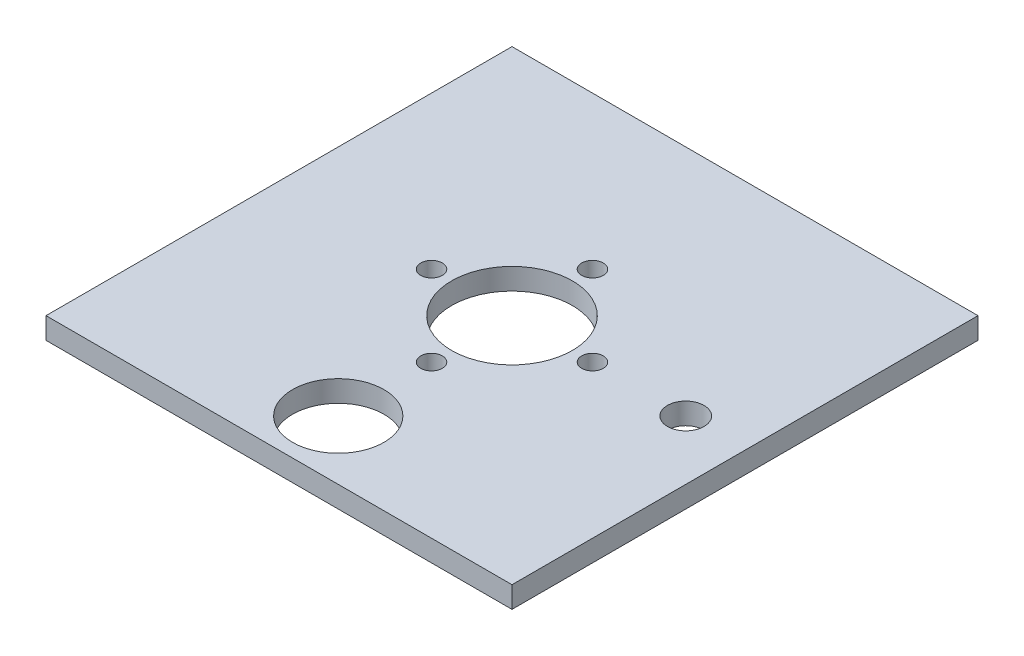
ISO-10303-21;
HEADER;
FILE_DESCRIPTION(('STEP AP214'),'2;1');
FILE_NAME('part.step','',(''),(''),'','','');
FILE_SCHEMA(('AUTOMOTIVE_DESIGN { 1 0 10303 214 1 1 1 1 }'));
ENDSEC;
DATA;
#1=APPLICATION_CONTEXT('core data for automotive mechanical design processes');
#2=APPLICATION_PROTOCOL_DEFINITION('international standard','automotive_design',2000,#1);
#3=PRODUCT_CONTEXT('',#1,'mechanical');
#4=PRODUCT('Part','Part','',(#3));
#5=PRODUCT_RELATED_PRODUCT_CATEGORY('part','',(#4));
#6=PRODUCT_DEFINITION_FORMATION('','',#4);
#7=PRODUCT_DEFINITION_CONTEXT('part definition',#1,'design');
#8=PRODUCT_DEFINITION('design','',#6,#7);
#9=PRODUCT_DEFINITION_SHAPE('','',#8);
#10=(LENGTH_UNIT() NAMED_UNIT(*) SI_UNIT(.MILLI.,.METRE.));
#11=(NAMED_UNIT(*) PLANE_ANGLE_UNIT() SI_UNIT($,.RADIAN.));
#12=(NAMED_UNIT(*) SI_UNIT($,.STERADIAN.) SOLID_ANGLE_UNIT());
#13=UNCERTAINTY_MEASURE_WITH_UNIT(LENGTH_MEASURE(1.E-05),#10,'distance_accuracy_value','');
#14=(GEOMETRIC_REPRESENTATION_CONTEXT(3) GLOBAL_UNCERTAINTY_ASSIGNED_CONTEXT((#13)) GLOBAL_UNIT_ASSIGNED_CONTEXT((#10,
#11,#12)) REPRESENTATION_CONTEXT('',''));
#15=CARTESIAN_POINT('',(0.,0.,0.));
#16=DIRECTION('',(0.,0.,1.));
#17=DIRECTION('',(1.,0.,0.));
#18=AXIS2_PLACEMENT_3D('',#15,#16,#17);
#19=CARTESIAN_POINT('',(0.,2.9718,0.));
#20=DIRECTION('',(0.,-1.,0.));
#21=DIRECTION('',(0.,0.,-1.));
#22=AXIS2_PLACEMENT_3D('',#19,#20,#21);
#23=PLANE('',#22);
#24=DIRECTION('',(0.,0.,-1.));
#25=VECTOR('',#24,1.);
#26=CARTESIAN_POINT('',(32.3596,2.9718,32.3596));
#27=LINE('',#26,#25);
#28=CARTESIAN_POINT('',(32.3596,2.9718,32.3596));
#29=VERTEX_POINT('',#28);
#30=CARTESIAN_POINT('',(32.3596,2.9718,-32.3596));
#31=VERTEX_POINT('',#30);
#32=EDGE_CURVE('E93',#29,#31,#27,.T.);
#33=ORIENTED_EDGE('',*,*,#32,.T.);
#34=DIRECTION('',(-1.,0.,0.));
#35=VECTOR('',#34,1.);
#36=CARTESIAN_POINT('',(-32.3596,2.9718,-32.3596));
#37=LINE('',#36,#35);
#38=CARTESIAN_POINT('',(-32.3596,2.9718,-32.3596));
#39=VERTEX_POINT('',#38);
#40=EDGE_CURVE('E88',#31,#39,#37,.T.);
#41=ORIENTED_EDGE('',*,*,#40,.T.);
#42=DIRECTION('',(0.,0.,1.));
#43=VECTOR('',#42,1.);
#44=CARTESIAN_POINT('',(-32.3596,2.9718,32.3596));
#45=LINE('',#44,#43);
#46=CARTESIAN_POINT('',(-32.3596,2.9718,32.3596));
#47=VERTEX_POINT('',#46);
#48=EDGE_CURVE('E91',#39,#47,#45,.T.);
#49=ORIENTED_EDGE('',*,*,#48,.T.);
#50=DIRECTION('',(1.,0.,0.));
#51=VECTOR('',#50,1.);
#52=CARTESIAN_POINT('',(-32.3596,2.9718,32.3596));
#53=LINE('',#52,#51);
#54=EDGE_CURVE('E58',#47,#29,#53,.T.);
#55=ORIENTED_EDGE('',*,*,#54,.T.);
#56=EDGE_LOOP('',(#33,#41,#49,#55));
#57=FACE_BOUND('',#56,.T.);
#58=CARTESIAN_POINT('',(24.13,2.9718,0.));
#59=DIRECTION('',(0.,1.,0.));
#60=DIRECTION('',(0.,0.,1.));
#61=AXIS2_PLACEMENT_3D('',#58,#59,#60);
#62=CIRCLE('',#61,2.54);
#63=CARTESIAN_POINT('',(24.13,2.9718,2.54));
#64=VERTEX_POINT('',#63);
#65=EDGE_CURVE('E121',#64,#64,#62,.T.);
#66=ORIENTED_EDGE('',*,*,#65,.F.);
#67=EDGE_LOOP('',(#66));
#68=FACE_BOUND('',#67,.T.);
#69=CARTESIAN_POINT('',(0.,2.9718,24.13));
#70=DIRECTION('',(0.,1.,0.));
#71=DIRECTION('',(0.,0.,1.));
#72=AXIS2_PLACEMENT_3D('',#69,#70,#71);
#73=CIRCLE('',#72,6.35);
#74=CARTESIAN_POINT('',(0.,2.9718,30.48));
#75=VERTEX_POINT('',#74);
#76=EDGE_CURVE('E132',#75,#75,#73,.T.);
#77=ORIENTED_EDGE('',*,*,#76,.F.);
#78=EDGE_LOOP('',(#77));
#79=FACE_BOUND('',#78,.T.);
#80=CARTESIAN_POINT('',(0.,2.9718,0.));
#81=DIRECTION('',(0.,1.,0.));
#82=DIRECTION('',(0.,0.,1.));
#83=AXIS2_PLACEMENT_3D('',#80,#81,#82);
#84=CIRCLE('',#83,8.382);
#85=CARTESIAN_POINT('',(0.,2.9718,8.382));
#86=VERTEX_POINT('',#85);
#87=EDGE_CURVE('E158',#86,#86,#84,.T.);
#88=ORIENTED_EDGE('',*,*,#87,.F.);
#89=EDGE_LOOP('',(#88));
#90=FACE_BOUND('',#89,.T.);
#91=CARTESIAN_POINT('',(0.,2.9718,-11.176));
#92=DIRECTION('',(0.,1.,0.));
#93=DIRECTION('',(0.,0.,1.));
#94=AXIS2_PLACEMENT_3D('',#91,#92,#93);
#95=CIRCLE('',#94,1.5);
#96=CARTESIAN_POINT('',(0.,2.9718,-9.676));
#97=VERTEX_POINT('',#96);
#98=EDGE_CURVE('E165',#97,#97,#95,.T.);
#99=ORIENTED_EDGE('',*,*,#98,.F.);
#100=EDGE_LOOP('',(#99));
#101=FACE_BOUND('',#100,.T.);
#102=CARTESIAN_POINT('',(11.176,2.9718,0.));
#103=DIRECTION('',(0.,1.,0.));
#104=DIRECTION('',(0.,0.,1.));
#105=AXIS2_PLACEMENT_3D('',#102,#103,#104);
#106=CIRCLE('',#105,1.5);
#107=CARTESIAN_POINT('',(11.176,2.9718,1.50000000000004));
#108=VERTEX_POINT('',#107);
#109=EDGE_CURVE('E173',#108,#108,#106,.T.);
#110=ORIENTED_EDGE('',*,*,#109,.F.);
#111=EDGE_LOOP('',(#110));
#112=FACE_BOUND('',#111,.T.);
#113=CARTESIAN_POINT('',(0.,2.9718,11.176));
#114=DIRECTION('',(0.,1.,0.));
#115=DIRECTION('',(0.,0.,1.));
#116=AXIS2_PLACEMENT_3D('',#113,#114,#115);
#117=CIRCLE('',#116,1.5);
#118=CARTESIAN_POINT('',(0.,2.9718,12.676));
#119=VERTEX_POINT('',#118);
#120=EDGE_CURVE('E181',#119,#119,#117,.T.);
#121=ORIENTED_EDGE('',*,*,#120,.F.);
#122=EDGE_LOOP('',(#121));
#123=FACE_BOUND('',#122,.T.);
#124=CARTESIAN_POINT('',(-11.176,2.9718,-1.17062386328733E-13));
#125=DIRECTION('',(0.,1.,0.));
#126=DIRECTION('',(0.,0.,1.));
#127=AXIS2_PLACEMENT_3D('',#124,#125,#126);
#128=CIRCLE('',#127,1.5);
#129=CARTESIAN_POINT('',(-11.176,2.9718,1.49999999999988));
#130=VERTEX_POINT('',#129);
#131=EDGE_CURVE('E189',#130,#130,#128,.T.);
#132=ORIENTED_EDGE('',*,*,#131,.F.);
#133=EDGE_LOOP('',(#132));
#134=FACE_BOUND('',#133,.T.);
#135=ADVANCED_FACE('F40',(#57,#68,#79,#90,#101,#112,#123,#134),#23,.F.);
#136=CARTESIAN_POINT('',(0.,0.,0.));
#137=DIRECTION('',(0.,-1.,0.));
#138=DIRECTION('',(0.,0.,-1.));
#139=AXIS2_PLACEMENT_3D('',#136,#137,#138);
#140=PLANE('',#139);
#141=CARTESIAN_POINT('',(0.,0.,11.176));
#142=DIRECTION('',(0.,1.,0.));
#143=DIRECTION('',(0.,0.,1.));
#144=AXIS2_PLACEMENT_3D('',#141,#142,#143);
#145=CIRCLE('',#144,1.5);
#146=CARTESIAN_POINT('',(0.,0.,12.676));
#147=VERTEX_POINT('',#146);
#148=EDGE_CURVE('E185',#147,#147,#145,.T.);
#149=ORIENTED_EDGE('',*,*,#148,.T.);
#150=EDGE_LOOP('',(#149));
#151=FACE_BOUND('',#150,.T.);
#152=CARTESIAN_POINT('',(0.,0.,-11.176));
#153=DIRECTION('',(0.,1.,0.));
#154=DIRECTION('',(0.,0.,1.));
#155=AXIS2_PLACEMENT_3D('',#152,#153,#154);
#156=CIRCLE('',#155,1.5);
#157=CARTESIAN_POINT('',(0.,0.,-9.676));
#158=VERTEX_POINT('',#157);
#159=EDGE_CURVE('E169',#158,#158,#156,.T.);
#160=ORIENTED_EDGE('',*,*,#159,.T.);
#161=EDGE_LOOP('',(#160));
#162=FACE_BOUND('',#161,.T.);
#163=CARTESIAN_POINT('',(0.,0.,24.13));
#164=DIRECTION('',(0.,1.,0.));
#165=DIRECTION('',(0.,0.,1.));
#166=AXIS2_PLACEMENT_3D('',#163,#164,#165);
#167=CIRCLE('',#166,6.35);
#168=CARTESIAN_POINT('',(0.,0.,30.48));
#169=VERTEX_POINT('',#168);
#170=EDGE_CURVE('E129',#169,#169,#167,.T.);
#171=ORIENTED_EDGE('',*,*,#170,.T.);
#172=EDGE_LOOP('',(#171));
#173=FACE_BOUND('',#172,.T.);
#174=DIRECTION('',(0.,0.,-1.));
#175=VECTOR('',#174,1.);
#176=CARTESIAN_POINT('',(32.3596,0.,32.3596));
#177=LINE('',#176,#175);
#178=CARTESIAN_POINT('',(32.3596,0.,32.3596));
#179=VERTEX_POINT('',#178);
#180=CARTESIAN_POINT('',(32.3596,0.,-32.3596));
#181=VERTEX_POINT('',#180);
#182=EDGE_CURVE('E127',#179,#181,#177,.T.);
#183=ORIENTED_EDGE('',*,*,#182,.F.);
#184=DIRECTION('',(1.,0.,0.));
#185=VECTOR('',#184,1.);
#186=CARTESIAN_POINT('',(-32.3596,0.,32.3596));
#187=LINE('',#186,#185);
#188=CARTESIAN_POINT('',(-32.3596,0.,32.3596));
#189=VERTEX_POINT('',#188);
#190=EDGE_CURVE('E81',#189,#179,#187,.T.);
#191=ORIENTED_EDGE('',*,*,#190,.F.);
#192=DIRECTION('',(0.,0.,1.));
#193=VECTOR('',#192,1.);
#194=CARTESIAN_POINT('',(-32.3596,0.,32.3596));
#195=LINE('',#194,#193);
#196=CARTESIAN_POINT('',(-32.3596,0.,-32.3596));
#197=VERTEX_POINT('',#196);
#198=EDGE_CURVE('E75',#197,#189,#195,.T.);
#199=ORIENTED_EDGE('',*,*,#198,.F.);
#200=DIRECTION('',(-1.,0.,0.));
#201=VECTOR('',#200,1.);
#202=CARTESIAN_POINT('',(-32.3596,0.,-32.3596));
#203=LINE('',#202,#201);
#204=EDGE_CURVE('E98',#181,#197,#203,.T.);
#205=ORIENTED_EDGE('',*,*,#204,.F.);
#206=EDGE_LOOP('',(#183,#191,#199,#205));
#207=FACE_BOUND('',#206,.T.);
#208=CARTESIAN_POINT('',(24.13,0.,0.));
#209=DIRECTION('',(0.,1.,0.));
#210=DIRECTION('',(0.,0.,1.));
#211=AXIS2_PLACEMENT_3D('',#208,#209,#210);
#212=CIRCLE('',#211,2.54);
#213=CARTESIAN_POINT('',(24.13,0.,2.54));
#214=VERTEX_POINT('',#213);
#215=EDGE_CURVE('E128',#214,#214,#212,.T.);
#216=ORIENTED_EDGE('',*,*,#215,.T.);
#217=EDGE_LOOP('',(#216));
#218=FACE_BOUND('',#217,.T.);
#219=CARTESIAN_POINT('',(0.,0.,0.));
#220=DIRECTION('',(0.,1.,0.));
#221=DIRECTION('',(0.,0.,1.));
#222=AXIS2_PLACEMENT_3D('',#219,#220,#221);
#223=CIRCLE('',#222,8.382);
#224=CARTESIAN_POINT('',(0.,0.,8.382));
#225=VERTEX_POINT('',#224);
#226=EDGE_CURVE('E161',#225,#225,#223,.T.);
#227=ORIENTED_EDGE('',*,*,#226,.T.);
#228=EDGE_LOOP('',(#227));
#229=FACE_BOUND('',#228,.T.);
#230=CARTESIAN_POINT('',(11.176,0.,0.));
#231=DIRECTION('',(0.,1.,0.));
#232=DIRECTION('',(0.,0.,1.));
#233=AXIS2_PLACEMENT_3D('',#230,#231,#232);
#234=CIRCLE('',#233,1.5);
#235=CARTESIAN_POINT('',(11.176,0.,1.50000000000004));
#236=VERTEX_POINT('',#235);
#237=EDGE_CURVE('E177',#236,#236,#234,.T.);
#238=ORIENTED_EDGE('',*,*,#237,.T.);
#239=EDGE_LOOP('',(#238));
#240=FACE_BOUND('',#239,.T.);
#241=CARTESIAN_POINT('',(-11.176,0.,-1.17062386328733E-13));
#242=DIRECTION('',(0.,1.,0.));
#243=DIRECTION('',(0.,0.,1.));
#244=AXIS2_PLACEMENT_3D('',#241,#242,#243);
#245=CIRCLE('',#244,1.5);
#246=CARTESIAN_POINT('',(-11.176,0.,1.49999999999988));
#247=VERTEX_POINT('',#246);
#248=EDGE_CURVE('E193',#247,#247,#245,.T.);
#249=ORIENTED_EDGE('',*,*,#248,.T.);
#250=EDGE_LOOP('',(#249));
#251=FACE_BOUND('',#250,.T.);
#252=ADVANCED_FACE('F147',(#151,#162,#173,#207,#218,#229,#240,#251),#140,.T.);
#253=CARTESIAN_POINT('',(32.3596,2.9718,32.3596));
#254=DIRECTION('',(-1.,0.,0.));
#255=DIRECTION('',(0.,0.,1.));
#256=AXIS2_PLACEMENT_3D('',#253,#254,#255);
#257=PLANE('',#256);
#258=ORIENTED_EDGE('',*,*,#182,.T.);
#259=DIRECTION('',(0.,-1.,0.));
#260=VECTOR('',#259,1.);
#261=CARTESIAN_POINT('',(32.3596,2.9718,-32.3596));
#262=LINE('',#261,#260);
#263=EDGE_CURVE('E12',#31,#181,#262,.T.);
#264=ORIENTED_EDGE('',*,*,#263,.F.);
#265=ORIENTED_EDGE('',*,*,#32,.F.);
#266=DIRECTION('',(0.,-1.,0.));
#267=VECTOR('',#266,1.);
#268=CARTESIAN_POINT('',(32.3596,2.9718,32.3596));
#269=LINE('',#268,#267);
#270=EDGE_CURVE('E105',#29,#179,#269,.T.);
#271=ORIENTED_EDGE('',*,*,#270,.T.);
#272=EDGE_LOOP('',(#258,#264,#265,#271));
#273=FACE_BOUND('',#272,.T.);
#274=ADVANCED_FACE('F42',(#273),#257,.F.);
#275=CARTESIAN_POINT('',(-32.3596,2.9718,-32.3596));
#276=DIRECTION('',(0.,0.,1.));
#277=DIRECTION('',(1.,0.,0.));
#278=AXIS2_PLACEMENT_3D('',#275,#276,#277);
#279=PLANE('',#278);
#280=ORIENTED_EDGE('',*,*,#204,.T.);
#281=DIRECTION('',(0.,-1.,0.));
#282=VECTOR('',#281,1.);
#283=CARTESIAN_POINT('',(-32.3596,2.9718,-32.3596));
#284=LINE('',#283,#282);
#285=EDGE_CURVE('E50',#39,#197,#284,.T.);
#286=ORIENTED_EDGE('',*,*,#285,.F.);
#287=ORIENTED_EDGE('',*,*,#40,.F.);
#288=ORIENTED_EDGE('',*,*,#263,.T.);
#289=EDGE_LOOP('',(#280,#286,#287,#288));
#290=FACE_BOUND('',#289,.T.);
#291=ADVANCED_FACE('F97',(#290),#279,.F.);
#292=CARTESIAN_POINT('',(-32.3596,2.9718,32.3596));
#293=DIRECTION('',(1.,0.,0.));
#294=DIRECTION('',(0.,0.,-1.));
#295=AXIS2_PLACEMENT_3D('',#292,#293,#294);
#296=PLANE('',#295);
#297=ORIENTED_EDGE('',*,*,#198,.T.);
#298=DIRECTION('',(0.,-1.,0.));
#299=VECTOR('',#298,1.);
#300=CARTESIAN_POINT('',(-32.3596,2.9718,32.3596));
#301=LINE('',#300,#299);
#302=EDGE_CURVE('E100',#47,#189,#301,.T.);
#303=ORIENTED_EDGE('',*,*,#302,.F.);
#304=ORIENTED_EDGE('',*,*,#48,.F.);
#305=ORIENTED_EDGE('',*,*,#285,.T.);
#306=EDGE_LOOP('',(#297,#303,#304,#305));
#307=FACE_BOUND('',#306,.T.);
#308=ADVANCED_FACE('F101',(#307),#296,.F.);
#309=CARTESIAN_POINT('',(-32.3596,2.9718,32.3596));
#310=DIRECTION('',(0.,0.,-1.));
#311=DIRECTION('',(-1.,0.,0.));
#312=AXIS2_PLACEMENT_3D('',#309,#310,#311);
#313=PLANE('',#312);
#314=ORIENTED_EDGE('',*,*,#190,.T.);
#315=ORIENTED_EDGE('',*,*,#270,.F.);
#316=ORIENTED_EDGE('',*,*,#54,.F.);
#317=ORIENTED_EDGE('',*,*,#302,.T.);
#318=EDGE_LOOP('',(#314,#315,#316,#317));
#319=FACE_BOUND('',#318,.T.);
#320=ADVANCED_FACE('F144',(#319),#313,.F.);
#321=CARTESIAN_POINT('',(24.13,2.9718,0.));
#322=DIRECTION('',(0.,-1.,0.));
#323=DIRECTION('',(0.,0.,-1.));
#324=AXIS2_PLACEMENT_3D('',#321,#322,#323);
#325=CYLINDRICAL_SURFACE('',#324,2.54);
#326=ORIENTED_EDGE('',*,*,#65,.T.);
#327=EDGE_LOOP('',(#326));
#328=FACE_BOUND('',#327,.T.);
#329=ORIENTED_EDGE('',*,*,#215,.F.);
#330=EDGE_LOOP('',(#329));
#331=FACE_BOUND('',#330,.T.);
#332=ADVANCED_FACE('F226',(#328,#331),#325,.F.);
#333=CARTESIAN_POINT('',(0.,2.9718,24.13));
#334=DIRECTION('',(0.,-1.,0.));
#335=DIRECTION('',(0.,0.,-1.));
#336=AXIS2_PLACEMENT_3D('',#333,#334,#335);
#337=CYLINDRICAL_SURFACE('',#336,6.35);
#338=ORIENTED_EDGE('',*,*,#76,.T.);
#339=EDGE_LOOP('',(#338));
#340=FACE_BOUND('',#339,.T.);
#341=ORIENTED_EDGE('',*,*,#170,.F.);
#342=EDGE_LOOP('',(#341));
#343=FACE_BOUND('',#342,.T.);
#344=ADVANCED_FACE('F272',(#340,#343),#337,.F.);
#345=CARTESIAN_POINT('',(0.,2.9718,0.));
#346=DIRECTION('',(0.,-1.,0.));
#347=DIRECTION('',(0.,0.,-1.));
#348=AXIS2_PLACEMENT_3D('',#345,#346,#347);
#349=CYLINDRICAL_SURFACE('',#348,8.382);
#350=ORIENTED_EDGE('',*,*,#87,.T.);
#351=EDGE_LOOP('',(#350));
#352=FACE_BOUND('',#351,.T.);
#353=ORIENTED_EDGE('',*,*,#226,.F.);
#354=EDGE_LOOP('',(#353));
#355=FACE_BOUND('',#354,.T.);
#356=ADVANCED_FACE('F280',(#352,#355),#349,.F.);
#357=CARTESIAN_POINT('',(0.,2.9718,-11.176));
#358=DIRECTION('',(0.,-1.,0.));
#359=DIRECTION('',(0.,0.,-1.));
#360=AXIS2_PLACEMENT_3D('',#357,#358,#359);
#361=CYLINDRICAL_SURFACE('',#360,1.5);
#362=ORIENTED_EDGE('',*,*,#98,.T.);
#363=EDGE_LOOP('',(#362));
#364=FACE_BOUND('',#363,.T.);
#365=ORIENTED_EDGE('',*,*,#159,.F.);
#366=EDGE_LOOP('',(#365));
#367=FACE_BOUND('',#366,.T.);
#368=ADVANCED_FACE('F288',(#364,#367),#361,.F.);
#369=CARTESIAN_POINT('',(11.176,2.9718,0.));
#370=DIRECTION('',(0.,-1.,0.));
#371=DIRECTION('',(0.,0.,-1.));
#372=AXIS2_PLACEMENT_3D('',#369,#370,#371);
#373=CYLINDRICAL_SURFACE('',#372,1.5);
#374=ORIENTED_EDGE('',*,*,#109,.T.);
#375=EDGE_LOOP('',(#374));
#376=FACE_BOUND('',#375,.T.);
#377=ORIENTED_EDGE('',*,*,#237,.F.);
#378=EDGE_LOOP('',(#377));
#379=FACE_BOUND('',#378,.T.);
#380=ADVANCED_FACE('F215',(#376,#379),#373,.F.);
#381=CARTESIAN_POINT('',(0.,2.9718,11.176));
#382=DIRECTION('',(0.,-1.,0.));
#383=DIRECTION('',(0.,0.,-1.));
#384=AXIS2_PLACEMENT_3D('',#381,#382,#383);
#385=CYLINDRICAL_SURFACE('',#384,1.5);
#386=ORIENTED_EDGE('',*,*,#120,.T.);
#387=EDGE_LOOP('',(#386));
#388=FACE_BOUND('',#387,.T.);
#389=ORIENTED_EDGE('',*,*,#148,.F.);
#390=EDGE_LOOP('',(#389));
#391=FACE_BOUND('',#390,.T.);
#392=ADVANCED_FACE('F209',(#388,#391),#385,.F.);
#393=CARTESIAN_POINT('',(-11.176,2.9718,-1.17062386328733E-13));
#394=DIRECTION('',(0.,-1.,0.));
#395=DIRECTION('',(0.,0.,-1.));
#396=AXIS2_PLACEMENT_3D('',#393,#394,#395);
#397=CYLINDRICAL_SURFACE('',#396,1.5);
#398=ORIENTED_EDGE('',*,*,#131,.T.);
#399=EDGE_LOOP('',(#398));
#400=FACE_BOUND('',#399,.T.);
#401=ORIENTED_EDGE('',*,*,#248,.F.);
#402=EDGE_LOOP('',(#401));
#403=FACE_BOUND('',#402,.T.);
#404=ADVANCED_FACE('F207',(#400,#403),#397,.F.);
#405=CLOSED_SHELL('',(#135,#252,#274,#291,#308,#320,#332,#344,#356,#368,#380,#392,#404));
#406=MANIFOLD_SOLID_BREP('B2',#405);
#407=ADVANCED_BREP_SHAPE_REPRESENTATION('',(#18,#406),#14);
#408=SHAPE_DEFINITION_REPRESENTATION(#9,#407);
ENDSEC;
END-ISO-10303-21;
